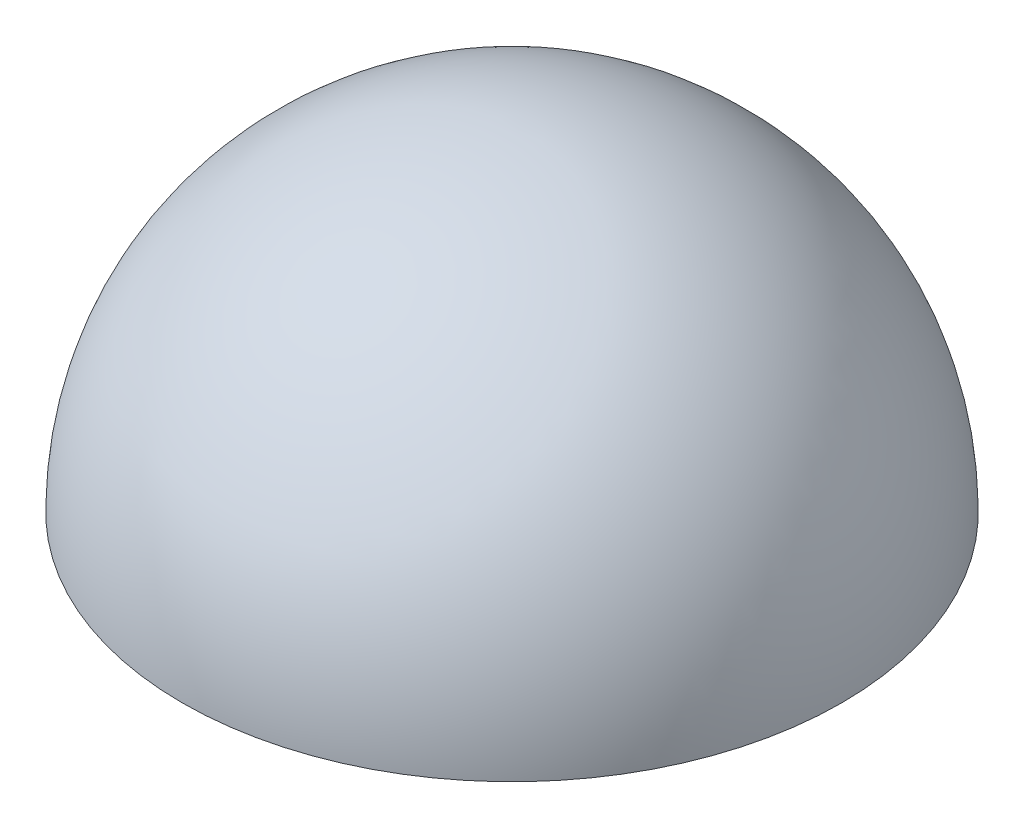
ISO-10303-21;
HEADER;
FILE_DESCRIPTION(('STEP AP214'),'2;1');
FILE_NAME('part.step','',(''),(''),'','','');
FILE_SCHEMA(('AUTOMOTIVE_DESIGN { 1 0 10303 214 1 1 1 1 }'));
ENDSEC;
DATA;
#1=APPLICATION_CONTEXT('core data for automotive mechanical design processes');
#2=APPLICATION_PROTOCOL_DEFINITION('international standard','automotive_design',2000,#1);
#3=PRODUCT_CONTEXT('',#1,'mechanical');
#4=PRODUCT('Part','Part','',(#3));
#5=PRODUCT_RELATED_PRODUCT_CATEGORY('part','',(#4));
#6=PRODUCT_DEFINITION_FORMATION('','',#4);
#7=PRODUCT_DEFINITION_CONTEXT('part definition',#1,'design');
#8=PRODUCT_DEFINITION('design','',#6,#7);
#9=PRODUCT_DEFINITION_SHAPE('','',#8);
#10=(LENGTH_UNIT() NAMED_UNIT(*) SI_UNIT(.MILLI.,.METRE.));
#11=(NAMED_UNIT(*) PLANE_ANGLE_UNIT() SI_UNIT($,.RADIAN.));
#12=(NAMED_UNIT(*) SI_UNIT($,.STERADIAN.) SOLID_ANGLE_UNIT());
#13=UNCERTAINTY_MEASURE_WITH_UNIT(LENGTH_MEASURE(1.E-05),#10,'distance_accuracy_value','');
#14=(GEOMETRIC_REPRESENTATION_CONTEXT(3) GLOBAL_UNCERTAINTY_ASSIGNED_CONTEXT((#13)) GLOBAL_UNIT_ASSIGNED_CONTEXT((#10,
#11,#12)) REPRESENTATION_CONTEXT('',''));
#15=CARTESIAN_POINT('',(0.,0.,0.));
#16=DIRECTION('',(0.,0.,1.));
#17=DIRECTION('',(1.,0.,0.));
#18=AXIS2_PLACEMENT_3D('',#15,#16,#17);
#19=CARTESIAN_POINT('',(0.,0.,0.));
#20=DIRECTION('',(0.,1.,0.));
#21=DIRECTION('',(1.,0.,0.));
#22=AXIS2_PLACEMENT_3D('',#19,#20,#21);
#23=SPHERICAL_SURFACE('',#22,2.7);
#24=CARTESIAN_POINT('',(0.,0.,0.));
#25=DIRECTION('',(0.,1.,0.));
#26=DIRECTION('',(-1.,0.,0.));
#27=AXIS2_PLACEMENT_3D('',#24,#25,#26);
#28=CIRCLE('',#27,2.7);
#29=CARTESIAN_POINT('',(-2.7,0.,0.));
#30=VERTEX_POINT('',#29);
#31=EDGE_CURVE('E10',#30,#30,#28,.T.);
#32=ORIENTED_EDGE('',*,*,#31,.T.);
#33=EDGE_LOOP('',(#32));
#34=FACE_BOUND('',#33,.T.);
#35=ADVANCED_FACE('F32',(#34),#23,.T.);
#36=CARTESIAN_POINT('',(1.5,0.,0.));
#37=DIRECTION('',(0.,1.,0.));
#38=DIRECTION('',(-1.,0.,0.));
#39=AXIS2_PLACEMENT_3D('',#36,#37,#38);
#40=PLANE('',#39);
#41=ORIENTED_EDGE('',*,*,#31,.F.);
#42=EDGE_LOOP('',(#41));
#43=FACE_BOUND('',#42,.T.);
#44=CARTESIAN_POINT('',(0.,0.,0.));
#45=DIRECTION('',(0.,1.,0.));
#46=DIRECTION('',(-1.,0.,0.));
#47=AXIS2_PLACEMENT_3D('',#44,#45,#46);
#48=CIRCLE('',#47,1.5);
#49=CARTESIAN_POINT('',(-1.5,0.,0.));
#50=VERTEX_POINT('',#49);
#51=EDGE_CURVE('E38',#50,#50,#48,.T.);
#52=ORIENTED_EDGE('',*,*,#51,.T.);
#53=EDGE_LOOP('',(#52));
#54=FACE_BOUND('',#53,.T.);
#55=ADVANCED_FACE('F57',(#43,#54),#40,.F.);
#56=CARTESIAN_POINT('',(0.,2.7,0.));
#57=DIRECTION('',(0.,1.,0.));
#58=DIRECTION('',(-1.,0.,0.));
#59=AXIS2_PLACEMENT_3D('',#56,#57,#58);
#60=CYLINDRICAL_SURFACE('',#59,1.5);
#61=ORIENTED_EDGE('',*,*,#51,.F.);
#62=EDGE_LOOP('',(#61));
#63=FACE_BOUND('',#62,.T.);
#64=CARTESIAN_POINT('',(0.,0.15,0.));
#65=DIRECTION('',(0.,1.,0.));
#66=DIRECTION('',(-1.,0.,0.));
#67=AXIS2_PLACEMENT_3D('',#64,#65,#66);
#68=CIRCLE('',#67,1.5);
#69=CARTESIAN_POINT('',(-1.5,0.149999999999999,0.));
#70=VERTEX_POINT('',#69);
#71=EDGE_CURVE('E42',#70,#70,#68,.T.);
#72=ORIENTED_EDGE('',*,*,#71,.T.);
#73=EDGE_LOOP('',(#72));
#74=FACE_BOUND('',#73,.T.);
#75=ADVANCED_FACE('F49',(#63,#74),#60,.F.);
#76=CARTESIAN_POINT('',(0.,0.15,0.));
#77=DIRECTION('',(0.,1.,0.));
#78=DIRECTION('',(-1.,0.,0.));
#79=AXIS2_PLACEMENT_3D('',#76,#77,#78);
#80=PLANE('',#79);
#81=ORIENTED_EDGE('',*,*,#71,.F.);
#82=EDGE_LOOP('',(#81));
#83=FACE_BOUND('',#82,.T.);
#84=ADVANCED_FACE('F51',(#83),#80,.F.);
#85=CLOSED_SHELL('',(#35,#55,#75,#84));
#86=MANIFOLD_SOLID_BREP('B2',#85);
#87=ADVANCED_BREP_SHAPE_REPRESENTATION('',(#18,#86),#14);
#88=SHAPE_DEFINITION_REPRESENTATION(#9,#87);
ENDSEC;
END-ISO-10303-21;
